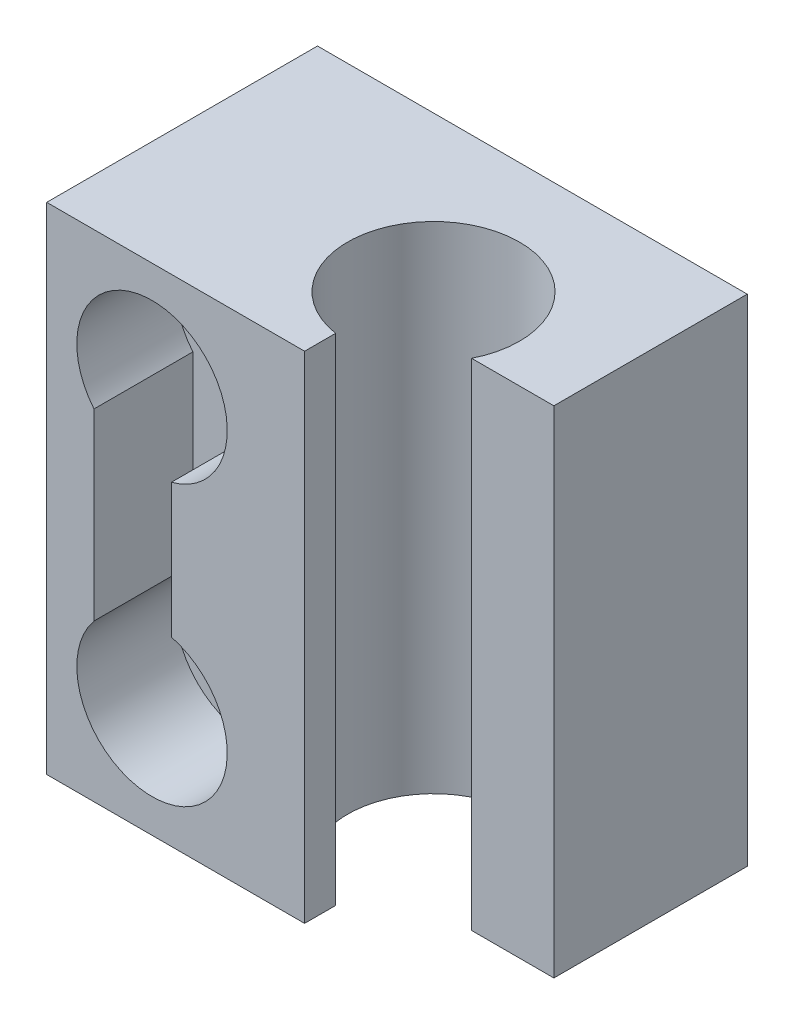
ISO-10303-21;
HEADER;
FILE_DESCRIPTION(('STEP AP214'),'2;1');
FILE_NAME('part.step','',(''),(''),'','','');
FILE_SCHEMA(('AUTOMOTIVE_DESIGN { 1 0 10303 214 1 1 1 1 }'));
ENDSEC;
DATA;
#1=APPLICATION_CONTEXT('core data for automotive mechanical design processes');
#2=APPLICATION_PROTOCOL_DEFINITION('international standard','automotive_design',2000,#1);
#3=PRODUCT_CONTEXT('',#1,'mechanical');
#4=PRODUCT('Part','Part','',(#3));
#5=PRODUCT_RELATED_PRODUCT_CATEGORY('part','',(#4));
#6=PRODUCT_DEFINITION_FORMATION('','',#4);
#7=PRODUCT_DEFINITION_CONTEXT('part definition',#1,'design');
#8=PRODUCT_DEFINITION('design','',#6,#7);
#9=PRODUCT_DEFINITION_SHAPE('','',#8);
#10=(LENGTH_UNIT() NAMED_UNIT(*) SI_UNIT(.MILLI.,.METRE.));
#11=(NAMED_UNIT(*) PLANE_ANGLE_UNIT() SI_UNIT($,.RADIAN.));
#12=(NAMED_UNIT(*) SI_UNIT($,.STERADIAN.) SOLID_ANGLE_UNIT());
#13=UNCERTAINTY_MEASURE_WITH_UNIT(LENGTH_MEASURE(1.E-05),#10,'distance_accuracy_value','');
#14=(GEOMETRIC_REPRESENTATION_CONTEXT(3) GLOBAL_UNCERTAINTY_ASSIGNED_CONTEXT((#13)) GLOBAL_UNIT_ASSIGNED_CONTEXT((#10,
#11,#12)) REPRESENTATION_CONTEXT('',''));
#15=CARTESIAN_POINT('',(0.,0.,0.));
#16=DIRECTION('',(0.,0.,1.));
#17=DIRECTION('',(1.,0.,0.));
#18=AXIS2_PLACEMENT_3D('',#15,#16,#17);
#19=CARTESIAN_POINT('',(-47.3281988950276,-29.6159790055249,16.002));
#20=DIRECTION('',(-1.,0.,0.));
#21=DIRECTION('',(0.,0.,1.));
#22=AXIS2_PLACEMENT_3D('',#19,#20,#21);
#23=PLANE('',#22);
#24=DIRECTION('',(0.,0.,-1.));
#25=VECTOR('',#24,1.);
#26=CARTESIAN_POINT('',(-47.3281988950276,-0.329779005524864,16.002));
#27=LINE('',#26,#25);
#28=CARTESIAN_POINT('',(-47.3281988950276,-0.329779005524864,11.43));
#29=VERTEX_POINT('',#28);
#30=CARTESIAN_POINT('',(-47.3281988950276,-0.329779005524864,0.));
#31=VERTEX_POINT('',#30);
#32=EDGE_CURVE('E11',#29,#31,#27,.T.);
#33=ORIENTED_EDGE('',*,*,#32,.F.);
#34=DIRECTION('',(0.,1.,0.));
#35=VECTOR('',#34,1.);
#36=CARTESIAN_POINT('',(-47.3281988950276,-29.6159790055249,11.43));
#37=LINE('',#36,#35);
#38=CARTESIAN_POINT('',(-47.3281988950276,-29.6159790055249,11.43));
#39=VERTEX_POINT('',#38);
#40=EDGE_CURVE('E117',#39,#29,#37,.T.);
#41=ORIENTED_EDGE('',*,*,#40,.F.);
#42=DIRECTION('',(0.,0.,-1.));
#43=VECTOR('',#42,1.);
#44=CARTESIAN_POINT('',(-47.3281988950276,-29.6159790055249,16.002));
#45=LINE('',#44,#43);
#46=CARTESIAN_POINT('',(-47.3281988950276,-29.6159790055249,0.));
#47=VERTEX_POINT('',#46);
#48=EDGE_CURVE('E129',#39,#47,#45,.T.);
#49=ORIENTED_EDGE('',*,*,#48,.T.);
#50=DIRECTION('',(0.,1.,0.));
#51=VECTOR('',#50,1.);
#52=CARTESIAN_POINT('',(-47.3281988950276,-29.6159790055249,0.));
#53=LINE('',#52,#51);
#54=EDGE_CURVE('E162',#47,#31,#53,.T.);
#55=ORIENTED_EDGE('',*,*,#54,.T.);
#56=EDGE_LOOP('',(#33,#41,#49,#55));
#57=FACE_BOUND('',#56,.T.);
#58=ADVANCED_FACE('F33',(#57),#23,.F.);
#59=CARTESIAN_POINT('',(-47.3281988950276,-0.329779005524864,16.002));
#60=DIRECTION('',(0.,-1.,0.));
#61=DIRECTION('',(1.,0.,0.));
#62=AXIS2_PLACEMENT_3D('',#59,#60,#61);
#63=PLANE('',#62);
#64=DIRECTION('',(-1.,0.,0.));
#65=VECTOR('',#64,1.);
#66=CARTESIAN_POINT('',(-47.3281988950276,-0.329779005524864,16.002));
#67=LINE('',#66,#65);
#68=CARTESIAN_POINT('',(-57.4881988950276,-0.329779005524865,16.002));
#69=VERTEX_POINT('',#68);
#70=CARTESIAN_POINT('',(-72.7281988950276,-0.329779005524867,16.002));
#71=VERTEX_POINT('',#70);
#72=EDGE_CURVE('E161',#69,#71,#67,.T.);
#73=ORIENTED_EDGE('',*,*,#72,.F.);
#74=DIRECTION('',(0.,0.,1.));
#75=VECTOR('',#74,1.);
#76=CARTESIAN_POINT('',(-57.4881988950276,-0.329779005524865,16.002));
#77=LINE('',#76,#75);
#78=CARTESIAN_POINT('',(-57.4881988950276,-0.329779005524865,14.1665248630544));
#79=VERTEX_POINT('',#78);
#80=EDGE_CURVE('E47',#79,#69,#77,.T.);
#81=ORIENTED_EDGE('',*,*,#80,.F.);
#82=CARTESIAN_POINT('',(-56.7261988950276,-0.329779005524865,9.144));
#83=DIRECTION('',(0.,1.,0.));
#84=DIRECTION('',(-1.,0.,0.));
#85=AXIS2_PLACEMENT_3D('',#82,#83,#84);
#86=CIRCLE('',#85,5.08);
#87=CARTESIAN_POINT('',(-52.1896138357567,-0.329779005524865,11.43));
#88=VERTEX_POINT('',#87);
#89=EDGE_CURVE('E216',#88,#79,#86,.T.);
#90=ORIENTED_EDGE('',*,*,#89,.F.);
#91=DIRECTION('',(-1.,0.,0.));
#92=VECTOR('',#91,1.);
#93=CARTESIAN_POINT('',(-47.3281988950276,-0.329779005524864,11.43));
#94=LINE('',#93,#92);
#95=EDGE_CURVE('E219',#29,#88,#94,.T.);
#96=ORIENTED_EDGE('',*,*,#95,.F.);
#97=ORIENTED_EDGE('',*,*,#32,.T.);
#98=DIRECTION('',(-1.,0.,0.));
#99=VECTOR('',#98,1.);
#100=CARTESIAN_POINT('',(-47.3281988950276,-0.329779005524864,0.));
#101=LINE('',#100,#99);
#102=CARTESIAN_POINT('',(-72.7281988950276,-0.329779005524867,0.));
#103=VERTEX_POINT('',#102);
#104=EDGE_CURVE('E160',#31,#103,#101,.T.);
#105=ORIENTED_EDGE('',*,*,#104,.T.);
#106=DIRECTION('',(0.,0.,-1.));
#107=VECTOR('',#106,1.);
#108=CARTESIAN_POINT('',(-72.7281988950276,-0.329779005524867,16.002));
#109=LINE('',#108,#107);
#110=EDGE_CURVE('E40',#71,#103,#109,.T.);
#111=ORIENTED_EDGE('',*,*,#110,.F.);
#112=EDGE_LOOP('',(#73,#81,#90,#96,#97,#105,#111));
#113=FACE_BOUND('',#112,.T.);
#114=ADVANCED_FACE('F232',(#113),#63,.F.);
#115=CARTESIAN_POINT('',(-72.7281988950276,-29.6159790055249,16.002));
#116=DIRECTION('',(1.,0.,0.));
#117=DIRECTION('',(0.,0.,-1.));
#118=AXIS2_PLACEMENT_3D('',#115,#116,#117);
#119=PLANE('',#118);
#120=DIRECTION('',(0.,-1.,0.));
#121=VECTOR('',#120,1.);
#122=CARTESIAN_POINT('',(-72.7281988950276,-29.6159790055249,0.));
#123=LINE('',#122,#121);
#124=CARTESIAN_POINT('',(-72.7281988950276,-29.6159790055249,0.));
#125=VERTEX_POINT('',#124);
#126=EDGE_CURVE('E154',#103,#125,#123,.T.);
#127=ORIENTED_EDGE('',*,*,#126,.T.);
#128=DIRECTION('',(0.,0.,-1.));
#129=VECTOR('',#128,1.);
#130=CARTESIAN_POINT('',(-72.7281988950276,-29.6159790055249,16.002));
#131=LINE('',#130,#129);
#132=CARTESIAN_POINT('',(-72.7281988950276,-29.6159790055249,16.002));
#133=VERTEX_POINT('',#132);
#134=EDGE_CURVE('E138',#133,#125,#131,.T.);
#135=ORIENTED_EDGE('',*,*,#134,.F.);
#136=DIRECTION('',(0.,-1.,0.));
#137=VECTOR('',#136,1.);
#138=CARTESIAN_POINT('',(-72.7281988950276,-29.6159790055249,16.002));
#139=LINE('',#138,#137);
#140=EDGE_CURVE('E143',#71,#133,#139,.T.);
#141=ORIENTED_EDGE('',*,*,#140,.F.);
#142=ORIENTED_EDGE('',*,*,#110,.T.);
#143=EDGE_LOOP('',(#127,#135,#141,#142));
#144=FACE_BOUND('',#143,.T.);
#145=ADVANCED_FACE('F152',(#144),#119,.F.);
#146=CARTESIAN_POINT('',(-47.3281988950276,-29.6159790055249,16.002));
#147=DIRECTION('',(0.,1.,0.));
#148=DIRECTION('',(-1.,0.,0.));
#149=AXIS2_PLACEMENT_3D('',#146,#147,#148);
#150=PLANE('',#149);
#151=CARTESIAN_POINT('',(-56.7261988950276,-29.6159790055249,9.144));
#152=DIRECTION('',(0.,1.,0.));
#153=DIRECTION('',(-1.,0.,0.));
#154=AXIS2_PLACEMENT_3D('',#151,#152,#153);
#155=CIRCLE('',#154,5.08);
#156=CARTESIAN_POINT('',(-52.1896138357567,-29.6159790055249,11.43));
#157=VERTEX_POINT('',#156);
#158=CARTESIAN_POINT('',(-57.4881988950276,-29.6159790055249,14.1665248630544));
#159=VERTEX_POINT('',#158);
#160=EDGE_CURVE('E124',#157,#159,#155,.T.);
#161=ORIENTED_EDGE('',*,*,#160,.T.);
#162=DIRECTION('',(0.,0.,1.));
#163=VECTOR('',#162,1.);
#164=CARTESIAN_POINT('',(-57.4881988950276,-29.6159790055249,16.002));
#165=LINE('',#164,#163);
#166=CARTESIAN_POINT('',(-57.4881988950276,-29.6159790055249,16.002));
#167=VERTEX_POINT('',#166);
#168=EDGE_CURVE('E131',#159,#167,#165,.T.);
#169=ORIENTED_EDGE('',*,*,#168,.T.);
#170=DIRECTION('',(1.,0.,0.));
#171=VECTOR('',#170,1.);
#172=CARTESIAN_POINT('',(-47.3281988950276,-29.6159790055249,16.002));
#173=LINE('',#172,#171);
#174=EDGE_CURVE('E139',#133,#167,#173,.T.);
#175=ORIENTED_EDGE('',*,*,#174,.F.);
#176=ORIENTED_EDGE('',*,*,#134,.T.);
#177=DIRECTION('',(1.,0.,0.));
#178=VECTOR('',#177,1.);
#179=CARTESIAN_POINT('',(-47.3281988950276,-29.6159790055249,0.));
#180=LINE('',#179,#178);
#181=EDGE_CURVE('E136',#125,#47,#180,.T.);
#182=ORIENTED_EDGE('',*,*,#181,.T.);
#183=ORIENTED_EDGE('',*,*,#48,.F.);
#184=DIRECTION('',(-1.,0.,0.));
#185=VECTOR('',#184,1.);
#186=CARTESIAN_POINT('',(-47.3281988950276,-29.6159790055249,11.43));
#187=LINE('',#186,#185);
#188=EDGE_CURVE('E113',#39,#157,#187,.T.);
#189=ORIENTED_EDGE('',*,*,#188,.T.);
#190=EDGE_LOOP('',(#161,#169,#175,#176,#182,#183,#189));
#191=FACE_BOUND('',#190,.T.);
#192=ADVANCED_FACE('F133',(#191),#150,.F.);
#193=CARTESIAN_POINT('',(0.,0.,16.002));
#194=DIRECTION('',(0.,0.,1.));
#195=DIRECTION('',(1.,0.,0.));
#196=AXIS2_PLACEMENT_3D('',#193,#194,#195);
#197=PLANE('',#196);
#198=DIRECTION('',(0.,1.,0.));
#199=VECTOR('',#198,1.);
#200=CARTESIAN_POINT('',(-57.4881988950276,-29.6159790055249,16.002));
#201=LINE('',#200,#199);
#202=EDGE_CURVE('E203',#167,#69,#201,.T.);
#203=ORIENTED_EDGE('',*,*,#202,.T.);
#204=ORIENTED_EDGE('',*,*,#72,.T.);
#205=ORIENTED_EDGE('',*,*,#140,.T.);
#206=ORIENTED_EDGE('',*,*,#174,.T.);
#207=EDGE_LOOP('',(#203,#204,#205,#206));
#208=FACE_BOUND('',#207,.T.);
#209=CARTESIAN_POINT('',(-66.5051988950276,-6.67977900552486,16.002));
#210=DIRECTION('',(0.,0.,1.));
#211=DIRECTION('',(1.,0.,0.));
#212=AXIS2_PLACEMENT_3D('',#209,#210,#211);
#213=CIRCLE('',#212,4.445);
#214=CARTESIAN_POINT('',(-65.3621988950276,-10.975308774948,16.002));
#215=VERTEX_POINT('',#214);
#216=CARTESIAN_POINT('',(-69.9341988950276,-9.50820330184252,16.002));
#217=VERTEX_POINT('',#216);
#218=EDGE_CURVE('E55',#215,#217,#213,.T.);
#219=ORIENTED_EDGE('',*,*,#218,.F.);
#220=DIRECTION('',(0.,1.,0.));
#221=VECTOR('',#220,1.);
#222=CARTESIAN_POINT('',(-65.3621988950276,-10.975308774948,16.002));
#223=LINE('',#222,#221);
#224=CARTESIAN_POINT('',(-65.3621988950276,-18.8942492361018,16.002));
#225=VERTEX_POINT('',#224);
#226=EDGE_CURVE('E177',#225,#215,#223,.T.);
#227=ORIENTED_EDGE('',*,*,#226,.F.);
#228=CARTESIAN_POINT('',(-66.5051988950276,-23.1897790055249,16.002));
#229=DIRECTION('',(0.,0.,1.));
#230=DIRECTION('',(1.,0.,0.));
#231=AXIS2_PLACEMENT_3D('',#228,#229,#230);
#232=CIRCLE('',#231,4.445);
#233=CARTESIAN_POINT('',(-69.9341988950276,-20.3613547092072,16.002));
#234=VERTEX_POINT('',#233);
#235=EDGE_CURVE('E181',#234,#225,#232,.T.);
#236=ORIENTED_EDGE('',*,*,#235,.F.);
#237=DIRECTION('',(0.,-1.,0.));
#238=VECTOR('',#237,1.);
#239=CARTESIAN_POINT('',(-69.9341988950276,-9.50820330184252,16.002));
#240=LINE('',#239,#238);
#241=EDGE_CURVE('E184',#217,#234,#240,.T.);
#242=ORIENTED_EDGE('',*,*,#241,.F.);
#243=EDGE_LOOP('',(#219,#227,#236,#242));
#244=FACE_BOUND('',#243,.T.);
#245=ADVANCED_FACE('F230',(#208,#244),#197,.T.);
#246=CARTESIAN_POINT('',(0.,0.,0.));
#247=DIRECTION('',(0.,0.,1.));
#248=DIRECTION('',(1.,0.,0.));
#249=AXIS2_PLACEMENT_3D('',#246,#247,#248);
#250=PLANE('',#249);
#251=CARTESIAN_POINT('',(-66.5051988950276,-6.67977900552486,0.));
#252=DIRECTION('',(0.,0.,1.));
#253=DIRECTION('',(1.,0.,0.));
#254=AXIS2_PLACEMENT_3D('',#251,#252,#253);
#255=CIRCLE('',#254,1.90500000000001);
#256=CARTESIAN_POINT('',(-64.6001988950276,-6.67977900552486,0.));
#257=VERTEX_POINT('',#256);
#258=EDGE_CURVE('E188',#257,#257,#255,.T.);
#259=ORIENTED_EDGE('',*,*,#258,.T.);
#260=EDGE_LOOP('',(#259));
#261=FACE_BOUND('',#260,.T.);
#262=CARTESIAN_POINT('',(-66.5051988950276,-23.1897790055249,0.));
#263=DIRECTION('',(0.,0.,1.));
#264=DIRECTION('',(1.,0.,0.));
#265=AXIS2_PLACEMENT_3D('',#262,#263,#264);
#266=CIRCLE('',#265,1.90500000000001);
#267=CARTESIAN_POINT('',(-64.6001988950276,-23.1897790055249,0.));
#268=VERTEX_POINT('',#267);
#269=EDGE_CURVE('E202',#268,#268,#266,.T.);
#270=ORIENTED_EDGE('',*,*,#269,.T.);
#271=EDGE_LOOP('',(#270));
#272=FACE_BOUND('',#271,.T.);
#273=ORIENTED_EDGE('',*,*,#54,.F.);
#274=ORIENTED_EDGE('',*,*,#181,.F.);
#275=ORIENTED_EDGE('',*,*,#126,.F.);
#276=ORIENTED_EDGE('',*,*,#104,.F.);
#277=EDGE_LOOP('',(#273,#274,#275,#276));
#278=FACE_BOUND('',#277,.T.);
#279=ADVANCED_FACE('F159',(#261,#272,#278),#250,.F.);
#280=CARTESIAN_POINT('',(-66.5051988950276,-6.67977900552486,10.16));
#281=DIRECTION('',(0.,0.,1.));
#282=DIRECTION('',(1.,0.,0.));
#283=AXIS2_PLACEMENT_3D('',#280,#281,#282);
#284=CYLINDRICAL_SURFACE('',#283,4.445);
#285=ORIENTED_EDGE('',*,*,#218,.T.);
#286=DIRECTION('',(0.,0.,1.));
#287=VECTOR('',#286,1.);
#288=CARTESIAN_POINT('',(-69.9341988950276,-9.50820330184252,10.16));
#289=LINE('',#288,#287);
#290=CARTESIAN_POINT('',(-69.9341988950276,-9.50820330184252,10.16));
#291=VERTEX_POINT('',#290);
#292=EDGE_CURVE('E169',#291,#217,#289,.T.);
#293=ORIENTED_EDGE('',*,*,#292,.F.);
#294=CARTESIAN_POINT('',(-66.5051988950276,-6.67977900552486,10.16));
#295=DIRECTION('',(0.,0.,1.));
#296=DIRECTION('',(1.,0.,0.));
#297=AXIS2_PLACEMENT_3D('',#294,#295,#296);
#298=CIRCLE('',#297,4.445);
#299=CARTESIAN_POINT('',(-65.3621988950276,-10.975308774948,10.16));
#300=VERTEX_POINT('',#299);
#301=EDGE_CURVE('E180',#300,#291,#298,.T.);
#302=ORIENTED_EDGE('',*,*,#301,.F.);
#303=DIRECTION('',(0.,0.,1.));
#304=VECTOR('',#303,1.);
#305=CARTESIAN_POINT('',(-65.3621988950276,-10.975308774948,10.16));
#306=LINE('',#305,#304);
#307=EDGE_CURVE('E165',#300,#215,#306,.T.);
#308=ORIENTED_EDGE('',*,*,#307,.T.);
#309=EDGE_LOOP('',(#285,#293,#302,#308));
#310=FACE_BOUND('',#309,.T.);
#311=ADVANCED_FACE('F244',(#310),#284,.F.);
#312=CARTESIAN_POINT('',(-65.3621988950276,-10.975308774948,10.16));
#313=DIRECTION('',(1.,0.,0.));
#314=DIRECTION('',(0.,0.,-1.));
#315=AXIS2_PLACEMENT_3D('',#312,#313,#314);
#316=PLANE('',#315);
#317=ORIENTED_EDGE('',*,*,#226,.T.);
#318=ORIENTED_EDGE('',*,*,#307,.F.);
#319=DIRECTION('',(0.,1.,0.));
#320=VECTOR('',#319,1.);
#321=CARTESIAN_POINT('',(-65.3621988950276,-10.975308774948,10.16));
#322=LINE('',#321,#320);
#323=CARTESIAN_POINT('',(-65.3621988950276,-18.8942492361018,10.16));
#324=VERTEX_POINT('',#323);
#325=EDGE_CURVE('E172',#324,#300,#322,.T.);
#326=ORIENTED_EDGE('',*,*,#325,.F.);
#327=DIRECTION('',(0.,0.,1.));
#328=VECTOR('',#327,1.);
#329=CARTESIAN_POINT('',(-65.3621988950276,-18.8942492361018,10.16));
#330=LINE('',#329,#328);
#331=EDGE_CURVE('E174',#324,#225,#330,.T.);
#332=ORIENTED_EDGE('',*,*,#331,.T.);
#333=EDGE_LOOP('',(#317,#318,#326,#332));
#334=FACE_BOUND('',#333,.T.);
#335=ADVANCED_FACE('F250',(#334),#316,.F.);
#336=CARTESIAN_POINT('',(-66.5051988950276,-23.1897790055249,10.16));
#337=DIRECTION('',(0.,0.,1.));
#338=DIRECTION('',(1.,0.,0.));
#339=AXIS2_PLACEMENT_3D('',#336,#337,#338);
#340=CYLINDRICAL_SURFACE('',#339,4.445);
#341=ORIENTED_EDGE('',*,*,#235,.T.);
#342=ORIENTED_EDGE('',*,*,#331,.F.);
#343=CARTESIAN_POINT('',(-66.5051988950276,-23.1897790055249,10.16));
#344=DIRECTION('',(0.,0.,1.));
#345=DIRECTION('',(1.,0.,0.));
#346=AXIS2_PLACEMENT_3D('',#343,#344,#345);
#347=CIRCLE('',#346,4.445);
#348=CARTESIAN_POINT('',(-69.9341988950276,-20.3613547092072,10.16));
#349=VERTEX_POINT('',#348);
#350=EDGE_CURVE('E191',#349,#324,#347,.T.);
#351=ORIENTED_EDGE('',*,*,#350,.F.);
#352=DIRECTION('',(0.,0.,1.));
#353=VECTOR('',#352,1.);
#354=CARTESIAN_POINT('',(-69.9341988950276,-20.3613547092072,10.16));
#355=LINE('',#354,#353);
#356=EDGE_CURVE('E171',#349,#234,#355,.T.);
#357=ORIENTED_EDGE('',*,*,#356,.T.);
#358=EDGE_LOOP('',(#341,#342,#351,#357));
#359=FACE_BOUND('',#358,.T.);
#360=ADVANCED_FACE('F255',(#359),#340,.F.);
#361=CARTESIAN_POINT('',(-69.9341988950276,-9.50820330184252,10.16));
#362=DIRECTION('',(-1.,0.,0.));
#363=DIRECTION('',(0.,0.,1.));
#364=AXIS2_PLACEMENT_3D('',#361,#362,#363);
#365=PLANE('',#364);
#366=ORIENTED_EDGE('',*,*,#241,.T.);
#367=ORIENTED_EDGE('',*,*,#356,.F.);
#368=DIRECTION('',(0.,-1.,0.));
#369=VECTOR('',#368,1.);
#370=CARTESIAN_POINT('',(-69.9341988950276,-9.50820330184252,10.16));
#371=LINE('',#370,#369);
#372=EDGE_CURVE('E194',#291,#349,#371,.T.);
#373=ORIENTED_EDGE('',*,*,#372,.F.);
#374=ORIENTED_EDGE('',*,*,#292,.T.);
#375=EDGE_LOOP('',(#366,#367,#373,#374));
#376=FACE_BOUND('',#375,.T.);
#377=ADVANCED_FACE('F251',(#376),#365,.F.);
#378=CARTESIAN_POINT('',(-66.5051988950276,-6.67977900552486,10.16));
#379=DIRECTION('',(0.,0.,1.));
#380=DIRECTION('',(1.,0.,0.));
#381=AXIS2_PLACEMENT_3D('',#378,#379,#380);
#382=PLANE('',#381);
#383=CARTESIAN_POINT('',(-66.5051988950276,-6.67977900552486,10.16));
#384=DIRECTION('',(0.,0.,1.));
#385=DIRECTION('',(1.,0.,0.));
#386=AXIS2_PLACEMENT_3D('',#383,#384,#385);
#387=CIRCLE('',#386,1.90500000000001);
#388=CARTESIAN_POINT('',(-64.6001988950276,-6.67977900552486,10.16));
#389=VERTEX_POINT('',#388);
#390=EDGE_CURVE('E206',#389,#389,#387,.T.);
#391=ORIENTED_EDGE('',*,*,#390,.F.);
#392=EDGE_LOOP('',(#391));
#393=FACE_BOUND('',#392,.T.);
#394=CARTESIAN_POINT('',(-66.5051988950276,-23.1897790055249,10.16));
#395=DIRECTION('',(0.,0.,1.));
#396=DIRECTION('',(1.,0.,0.));
#397=AXIS2_PLACEMENT_3D('',#394,#395,#396);
#398=CIRCLE('',#397,1.90500000000001);
#399=CARTESIAN_POINT('',(-64.6001988950276,-23.1897790055249,10.16));
#400=VERTEX_POINT('',#399);
#401=EDGE_CURVE('E199',#400,#400,#398,.T.);
#402=ORIENTED_EDGE('',*,*,#401,.F.);
#403=EDGE_LOOP('',(#402));
#404=FACE_BOUND('',#403,.T.);
#405=ORIENTED_EDGE('',*,*,#301,.T.);
#406=ORIENTED_EDGE('',*,*,#372,.T.);
#407=ORIENTED_EDGE('',*,*,#350,.T.);
#408=ORIENTED_EDGE('',*,*,#325,.T.);
#409=EDGE_LOOP('',(#405,#406,#407,#408));
#410=FACE_BOUND('',#409,.T.);
#411=ADVANCED_FACE('F254',(#393,#404,#410),#382,.T.);
#412=CARTESIAN_POINT('',(-66.5051988950276,-23.1897790055249,0.));
#413=DIRECTION('',(0.,0.,1.));
#414=DIRECTION('',(1.,0.,0.));
#415=AXIS2_PLACEMENT_3D('',#412,#413,#414);
#416=CYLINDRICAL_SURFACE('',#415,1.90500000000001);
#417=ORIENTED_EDGE('',*,*,#269,.F.);
#418=EDGE_LOOP('',(#417));
#419=FACE_BOUND('',#418,.T.);
#420=ORIENTED_EDGE('',*,*,#401,.T.);
#421=EDGE_LOOP('',(#420));
#422=FACE_BOUND('',#421,.T.);
#423=ADVANCED_FACE('F265',(#419,#422),#416,.F.);
#424=CARTESIAN_POINT('',(-66.5051988950276,-6.67977900552486,0.));
#425=DIRECTION('',(0.,0.,1.));
#426=DIRECTION('',(1.,0.,0.));
#427=AXIS2_PLACEMENT_3D('',#424,#425,#426);
#428=CYLINDRICAL_SURFACE('',#427,1.90500000000001);
#429=ORIENTED_EDGE('',*,*,#258,.F.);
#430=EDGE_LOOP('',(#429));
#431=FACE_BOUND('',#430,.T.);
#432=ORIENTED_EDGE('',*,*,#390,.T.);
#433=EDGE_LOOP('',(#432));
#434=FACE_BOUND('',#433,.T.);
#435=ADVANCED_FACE('F269',(#431,#434),#428,.F.);
#436=CARTESIAN_POINT('',(-57.4881988950276,-29.6159790055249,16.002));
#437=DIRECTION('',(-1.,0.,0.));
#438=DIRECTION('',(0.,-1.,0.));
#439=AXIS2_PLACEMENT_3D('',#436,#437,#438);
#440=PLANE('',#439);
#441=ORIENTED_EDGE('',*,*,#80,.T.);
#442=ORIENTED_EDGE('',*,*,#202,.F.);
#443=ORIENTED_EDGE('',*,*,#168,.F.);
#444=DIRECTION('',(0.,1.,0.));
#445=VECTOR('',#444,1.);
#446=CARTESIAN_POINT('',(-57.4881988950276,-29.6159790055249,14.1665248630544));
#447=LINE('',#446,#445);
#448=EDGE_CURVE('E212',#159,#79,#447,.T.);
#449=ORIENTED_EDGE('',*,*,#448,.T.);
#450=EDGE_LOOP('',(#441,#442,#443,#449));
#451=FACE_BOUND('',#450,.T.);
#452=ADVANCED_FACE('F228',(#451),#440,.F.);
#453=CARTESIAN_POINT('',(-56.7261988950276,-29.6159790055249,9.144));
#454=DIRECTION('',(0.,1.,0.));
#455=DIRECTION('',(-1.,0.,0.));
#456=AXIS2_PLACEMENT_3D('',#453,#454,#455);
#457=CYLINDRICAL_SURFACE('',#456,5.08);
#458=ORIENTED_EDGE('',*,*,#89,.T.);
#459=ORIENTED_EDGE('',*,*,#448,.F.);
#460=ORIENTED_EDGE('',*,*,#160,.F.);
#461=DIRECTION('',(0.,1.,0.));
#462=VECTOR('',#461,1.);
#463=CARTESIAN_POINT('',(-52.1896138357567,-29.6159790055249,11.43));
#464=LINE('',#463,#462);
#465=EDGE_CURVE('E119',#157,#88,#464,.T.);
#466=ORIENTED_EDGE('',*,*,#465,.T.);
#467=EDGE_LOOP('',(#458,#459,#460,#466));
#468=FACE_BOUND('',#467,.T.);
#469=ADVANCED_FACE('F226',(#468),#457,.F.);
#470=CARTESIAN_POINT('',(-47.3281988950276,-29.6159790055249,11.43));
#471=DIRECTION('',(0.,0.,-1.));
#472=DIRECTION('',(-1.,0.,0.));
#473=AXIS2_PLACEMENT_3D('',#470,#471,#472);
#474=PLANE('',#473);
#475=ORIENTED_EDGE('',*,*,#95,.T.);
#476=ORIENTED_EDGE('',*,*,#465,.F.);
#477=ORIENTED_EDGE('',*,*,#188,.F.);
#478=ORIENTED_EDGE('',*,*,#40,.T.);
#479=EDGE_LOOP('',(#475,#476,#477,#478));
#480=FACE_BOUND('',#479,.T.);
#481=ADVANCED_FACE('F116',(#480),#474,.F.);
#482=CLOSED_SHELL('',(#58,#114,#145,#192,#245,#279,#311,#335,#360,#377,#411,#423,#435,#452,#469,#481));
#483=MANIFOLD_SOLID_BREP('B2',#482);
#484=ADVANCED_BREP_SHAPE_REPRESENTATION('',(#18,#483),#14);
#485=SHAPE_DEFINITION_REPRESENTATION(#9,#484);
ENDSEC;
END-ISO-10303-21;
